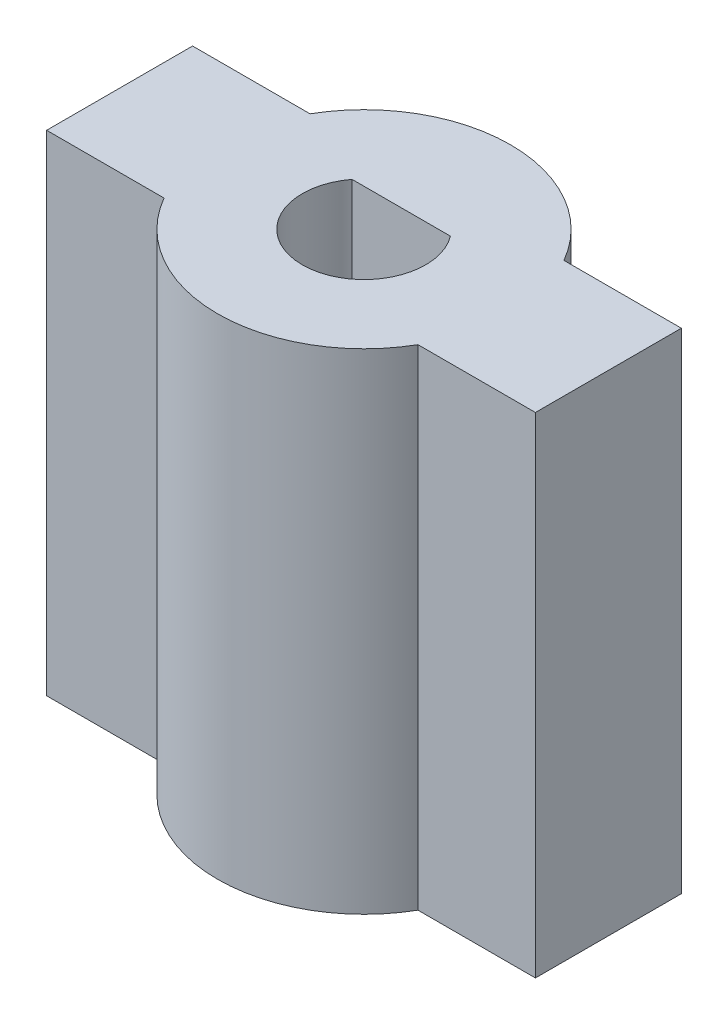
ISO-10303-21;
HEADER;
FILE_DESCRIPTION(('STEP AP214'),'2;1');
FILE_NAME('part.step','',(''),(''),'','','');
FILE_SCHEMA(('AUTOMOTIVE_DESIGN { 1 0 10303 214 1 1 1 1 }'));
ENDSEC;
DATA;
#1=APPLICATION_CONTEXT('core data for automotive mechanical design processes');
#2=APPLICATION_PROTOCOL_DEFINITION('international standard','automotive_design',2000,#1);
#3=PRODUCT_CONTEXT('',#1,'mechanical');
#4=PRODUCT('Part','Part','',(#3));
#5=PRODUCT_RELATED_PRODUCT_CATEGORY('part','',(#4));
#6=PRODUCT_DEFINITION_FORMATION('','',#4);
#7=PRODUCT_DEFINITION_CONTEXT('part definition',#1,'design');
#8=PRODUCT_DEFINITION('design','',#6,#7);
#9=PRODUCT_DEFINITION_SHAPE('','',#8);
#10=(LENGTH_UNIT() NAMED_UNIT(*) SI_UNIT(.MILLI.,.METRE.));
#11=(NAMED_UNIT(*) PLANE_ANGLE_UNIT() SI_UNIT($,.RADIAN.));
#12=(NAMED_UNIT(*) SI_UNIT($,.STERADIAN.) SOLID_ANGLE_UNIT());
#13=UNCERTAINTY_MEASURE_WITH_UNIT(LENGTH_MEASURE(1.E-05),#10,'distance_accuracy_value','');
#14=(GEOMETRIC_REPRESENTATION_CONTEXT(3) GLOBAL_UNCERTAINTY_ASSIGNED_CONTEXT((#13)) GLOBAL_UNIT_ASSIGNED_CONTEXT((#10,
#11,#12)) REPRESENTATION_CONTEXT('',''));
#15=CARTESIAN_POINT('',(0.,0.,0.));
#16=DIRECTION('',(0.,0.,1.));
#17=DIRECTION('',(1.,0.,0.));
#18=AXIS2_PLACEMENT_3D('',#15,#16,#17);
#19=CARTESIAN_POINT('',(0.,20.,0.));
#20=DIRECTION('',(0.,-1.,0.));
#21=DIRECTION('',(0.,0.,-1.));
#22=AXIS2_PLACEMENT_3D('',#19,#20,#21);
#23=CYLINDRICAL_SURFACE('',#22,5.98);
#24=CARTESIAN_POINT('',(0.,0.,0.));
#25=DIRECTION('',(0.,1.,0.));
#26=DIRECTION('',(0.,0.,1.));
#27=AXIS2_PLACEMENT_3D('',#24,#25,#26);
#28=CIRCLE('',#27,5.98);
#29=CARTESIAN_POINT('',(5.18459255872629,0.,-2.98));
#30=VERTEX_POINT('',#29);
#31=CARTESIAN_POINT('',(-5.18459255872629,0.,-2.98));
#32=VERTEX_POINT('',#31);
#33=EDGE_CURVE('E143',#30,#32,#28,.T.);
#34=ORIENTED_EDGE('',*,*,#33,.T.);
#35=DIRECTION('',(0.,-1.,0.));
#36=VECTOR('',#35,1.);
#37=CARTESIAN_POINT('',(-5.18459255872629,20.,-2.98));
#38=LINE('',#37,#36);
#39=CARTESIAN_POINT('',(-5.18459255872629,20.,-2.98));
#40=VERTEX_POINT('',#39);
#41=EDGE_CURVE('E11',#40,#32,#38,.T.);
#42=ORIENTED_EDGE('',*,*,#41,.F.);
#43=CARTESIAN_POINT('',(0.,20.,0.));
#44=DIRECTION('',(0.,1.,0.));
#45=DIRECTION('',(0.,0.,1.));
#46=AXIS2_PLACEMENT_3D('',#43,#44,#45);
#47=CIRCLE('',#46,5.98);
#48=CARTESIAN_POINT('',(5.18459255872629,20.,-2.98));
#49=VERTEX_POINT('',#48);
#50=EDGE_CURVE('E159',#49,#40,#47,.T.);
#51=ORIENTED_EDGE('',*,*,#50,.F.);
#52=DIRECTION('',(0.,-1.,0.));
#53=VECTOR('',#52,1.);
#54=CARTESIAN_POINT('',(5.18459255872629,20.,-2.98));
#55=LINE('',#54,#53);
#56=EDGE_CURVE('E139',#49,#30,#55,.T.);
#57=ORIENTED_EDGE('',*,*,#56,.T.);
#58=EDGE_LOOP('',(#34,#42,#51,#57));
#59=FACE_BOUND('',#58,.T.);
#60=ADVANCED_FACE('F35',(#59),#23,.T.);
#61=CARTESIAN_POINT('',(-5.18459255872629,20.,-2.98));
#62=DIRECTION('',(0.,0.,1.));
#63=DIRECTION('',(1.,0.,0.));
#64=AXIS2_PLACEMENT_3D('',#61,#62,#63);
#65=PLANE('',#64);
#66=DIRECTION('',(-1.,0.,0.));
#67=VECTOR('',#66,1.);
#68=CARTESIAN_POINT('',(-5.18459255872629,0.,-2.98));
#69=LINE('',#68,#67);
#70=CARTESIAN_POINT('',(-9.98,0.,-2.98));
#71=VERTEX_POINT('',#70);
#72=EDGE_CURVE('E146',#32,#71,#69,.T.);
#73=ORIENTED_EDGE('',*,*,#72,.T.);
#74=DIRECTION('',(0.,-1.,0.));
#75=VECTOR('',#74,1.);
#76=CARTESIAN_POINT('',(-9.98,20.,-2.98));
#77=LINE('',#76,#75);
#78=CARTESIAN_POINT('',(-9.98,20.,-2.98));
#79=VERTEX_POINT('',#78);
#80=EDGE_CURVE('E42',#79,#71,#77,.T.);
#81=ORIENTED_EDGE('',*,*,#80,.F.);
#82=DIRECTION('',(-1.,0.,0.));
#83=VECTOR('',#82,1.);
#84=CARTESIAN_POINT('',(-5.18459255872629,20.,-2.98));
#85=LINE('',#84,#83);
#86=EDGE_CURVE('E99',#40,#79,#85,.T.);
#87=ORIENTED_EDGE('',*,*,#86,.F.);
#88=ORIENTED_EDGE('',*,*,#41,.T.);
#89=EDGE_LOOP('',(#73,#81,#87,#88));
#90=FACE_BOUND('',#89,.T.);
#91=ADVANCED_FACE('F232',(#90),#65,.F.);
#92=CARTESIAN_POINT('',(-9.98,20.,2.98));
#93=DIRECTION('',(1.,0.,0.));
#94=DIRECTION('',(0.,0.,-1.));
#95=AXIS2_PLACEMENT_3D('',#92,#93,#94);
#96=PLANE('',#95);
#97=DIRECTION('',(0.,0.,1.));
#98=VECTOR('',#97,1.);
#99=CARTESIAN_POINT('',(-9.98,0.,2.98));
#100=LINE('',#99,#98);
#101=CARTESIAN_POINT('',(-9.98,0.,2.98));
#102=VERTEX_POINT('',#101);
#103=EDGE_CURVE('E149',#71,#102,#100,.T.);
#104=ORIENTED_EDGE('',*,*,#103,.T.);
#105=DIRECTION('',(0.,-1.,0.));
#106=VECTOR('',#105,1.);
#107=CARTESIAN_POINT('',(-9.98,20.,2.98));
#108=LINE('',#107,#106);
#109=CARTESIAN_POINT('',(-9.98,20.,2.98));
#110=VERTEX_POINT('',#109);
#111=EDGE_CURVE('E166',#110,#102,#108,.T.);
#112=ORIENTED_EDGE('',*,*,#111,.F.);
#113=DIRECTION('',(0.,0.,1.));
#114=VECTOR('',#113,1.);
#115=CARTESIAN_POINT('',(-9.98,20.,2.98));
#116=LINE('',#115,#114);
#117=EDGE_CURVE('E174',#79,#110,#116,.T.);
#118=ORIENTED_EDGE('',*,*,#117,.F.);
#119=ORIENTED_EDGE('',*,*,#80,.T.);
#120=EDGE_LOOP('',(#104,#112,#118,#119));
#121=FACE_BOUND('',#120,.T.);
#122=ADVANCED_FACE('F172',(#121),#96,.F.);
#123=CARTESIAN_POINT('',(-5.18459255872629,20.,2.98));
#124=DIRECTION('',(0.,0.,-1.));
#125=DIRECTION('',(-1.,0.,0.));
#126=AXIS2_PLACEMENT_3D('',#123,#124,#125);
#127=PLANE('',#126);
#128=DIRECTION('',(1.,0.,0.));
#129=VECTOR('',#128,1.);
#130=CARTESIAN_POINT('',(-5.18459255872629,0.,2.98));
#131=LINE('',#130,#129);
#132=CARTESIAN_POINT('',(-5.18459255872629,0.,2.98));
#133=VERTEX_POINT('',#132);
#134=EDGE_CURVE('E151',#102,#133,#131,.T.);
#135=ORIENTED_EDGE('',*,*,#134,.T.);
#136=DIRECTION('',(0.,-1.,0.));
#137=VECTOR('',#136,1.);
#138=CARTESIAN_POINT('',(-5.18459255872629,20.,2.98));
#139=LINE('',#138,#137);
#140=CARTESIAN_POINT('',(-5.18459255872629,20.,2.98));
#141=VERTEX_POINT('',#140);
#142=EDGE_CURVE('E163',#141,#133,#139,.T.);
#143=ORIENTED_EDGE('',*,*,#142,.F.);
#144=DIRECTION('',(1.,0.,0.));
#145=VECTOR('',#144,1.);
#146=CARTESIAN_POINT('',(-5.18459255872629,20.,2.98));
#147=LINE('',#146,#145);
#148=EDGE_CURVE('E186',#110,#141,#147,.T.);
#149=ORIENTED_EDGE('',*,*,#148,.F.);
#150=ORIENTED_EDGE('',*,*,#111,.T.);
#151=EDGE_LOOP('',(#135,#143,#149,#150));
#152=FACE_BOUND('',#151,.T.);
#153=ADVANCED_FACE('F182',(#152),#127,.F.);
#154=CARTESIAN_POINT('',(0.,20.,0.));
#155=DIRECTION('',(0.,-1.,0.));
#156=DIRECTION('',(0.,0.,-1.));
#157=AXIS2_PLACEMENT_3D('',#154,#155,#156);
#158=CYLINDRICAL_SURFACE('',#157,5.98);
#159=CARTESIAN_POINT('',(0.,0.,0.));
#160=DIRECTION('',(0.,1.,0.));
#161=DIRECTION('',(0.,0.,1.));
#162=AXIS2_PLACEMENT_3D('',#159,#160,#161);
#163=CIRCLE('',#162,5.98);
#164=CARTESIAN_POINT('',(5.18459255872629,0.,2.98));
#165=VERTEX_POINT('',#164);
#166=EDGE_CURVE('E153',#133,#165,#163,.T.);
#167=ORIENTED_EDGE('',*,*,#166,.T.);
#168=DIRECTION('',(0.,-1.,0.));
#169=VECTOR('',#168,1.);
#170=CARTESIAN_POINT('',(5.18459255872629,20.,2.98));
#171=LINE('',#170,#169);
#172=CARTESIAN_POINT('',(5.18459255872629,20.,2.98));
#173=VERTEX_POINT('',#172);
#174=EDGE_CURVE('E134',#173,#165,#171,.T.);
#175=ORIENTED_EDGE('',*,*,#174,.F.);
#176=CARTESIAN_POINT('',(0.,20.,0.));
#177=DIRECTION('',(0.,1.,0.));
#178=DIRECTION('',(0.,0.,1.));
#179=AXIS2_PLACEMENT_3D('',#176,#177,#178);
#180=CIRCLE('',#179,5.98);
#181=EDGE_CURVE('E122',#141,#173,#180,.T.);
#182=ORIENTED_EDGE('',*,*,#181,.F.);
#183=ORIENTED_EDGE('',*,*,#142,.T.);
#184=EDGE_LOOP('',(#167,#175,#182,#183));
#185=FACE_BOUND('',#184,.T.);
#186=ADVANCED_FACE('F185',(#185),#158,.T.);
#187=CARTESIAN_POINT('',(9.98,20.,2.98));
#188=DIRECTION('',(0.,0.,-1.));
#189=DIRECTION('',(-1.,0.,0.));
#190=AXIS2_PLACEMENT_3D('',#187,#188,#189);
#191=PLANE('',#190);
#192=DIRECTION('',(1.,0.,0.));
#193=VECTOR('',#192,1.);
#194=CARTESIAN_POINT('',(9.98,0.,2.98));
#195=LINE('',#194,#193);
#196=CARTESIAN_POINT('',(9.98,0.,2.98));
#197=VERTEX_POINT('',#196);
#198=EDGE_CURVE('E131',#165,#197,#195,.T.);
#199=ORIENTED_EDGE('',*,*,#198,.T.);
#200=DIRECTION('',(0.,-1.,0.));
#201=VECTOR('',#200,1.);
#202=CARTESIAN_POINT('',(9.98,20.,2.98));
#203=LINE('',#202,#201);
#204=CARTESIAN_POINT('',(9.98,20.,2.98));
#205=VERTEX_POINT('',#204);
#206=EDGE_CURVE('E128',#205,#197,#203,.T.);
#207=ORIENTED_EDGE('',*,*,#206,.F.);
#208=DIRECTION('',(1.,0.,0.));
#209=VECTOR('',#208,1.);
#210=CARTESIAN_POINT('',(9.98,20.,2.98));
#211=LINE('',#210,#209);
#212=EDGE_CURVE('E115',#173,#205,#211,.T.);
#213=ORIENTED_EDGE('',*,*,#212,.F.);
#214=ORIENTED_EDGE('',*,*,#174,.T.);
#215=EDGE_LOOP('',(#199,#207,#213,#214));
#216=FACE_BOUND('',#215,.T.);
#217=ADVANCED_FACE('F129',(#216),#191,.F.);
#218=CARTESIAN_POINT('',(9.98,20.,2.98));
#219=DIRECTION('',(-1.,0.,0.));
#220=DIRECTION('',(0.,0.,1.));
#221=AXIS2_PLACEMENT_3D('',#218,#219,#220);
#222=PLANE('',#221);
#223=DIRECTION('',(0.,0.,-1.));
#224=VECTOR('',#223,1.);
#225=CARTESIAN_POINT('',(9.98,0.,2.98));
#226=LINE('',#225,#224);
#227=CARTESIAN_POINT('',(9.98,0.,-2.98));
#228=VERTEX_POINT('',#227);
#229=EDGE_CURVE('E156',#197,#228,#226,.T.);
#230=ORIENTED_EDGE('',*,*,#229,.T.);
#231=DIRECTION('',(0.,-1.,0.));
#232=VECTOR('',#231,1.);
#233=CARTESIAN_POINT('',(9.98,20.,-2.98));
#234=LINE('',#233,#232);
#235=CARTESIAN_POINT('',(9.98,20.,-2.98));
#236=VERTEX_POINT('',#235);
#237=EDGE_CURVE('E135',#236,#228,#234,.T.);
#238=ORIENTED_EDGE('',*,*,#237,.F.);
#239=DIRECTION('',(0.,0.,-1.));
#240=VECTOR('',#239,1.);
#241=CARTESIAN_POINT('',(9.98,20.,2.98));
#242=LINE('',#241,#240);
#243=EDGE_CURVE('E119',#205,#236,#242,.T.);
#244=ORIENTED_EDGE('',*,*,#243,.F.);
#245=ORIENTED_EDGE('',*,*,#206,.T.);
#246=EDGE_LOOP('',(#230,#238,#244,#245));
#247=FACE_BOUND('',#246,.T.);
#248=ADVANCED_FACE('F137',(#247),#222,.F.);
#249=CARTESIAN_POINT('',(9.98,20.,-2.98));
#250=DIRECTION('',(0.,0.,1.));
#251=DIRECTION('',(1.,0.,0.));
#252=AXIS2_PLACEMENT_3D('',#249,#250,#251);
#253=PLANE('',#252);
#254=DIRECTION('',(-1.,0.,0.));
#255=VECTOR('',#254,1.);
#256=CARTESIAN_POINT('',(9.98,0.,-2.98));
#257=LINE('',#256,#255);
#258=EDGE_CURVE('E91',#228,#30,#257,.T.);
#259=ORIENTED_EDGE('',*,*,#258,.T.);
#260=ORIENTED_EDGE('',*,*,#56,.F.);
#261=DIRECTION('',(-1.,0.,0.));
#262=VECTOR('',#261,1.);
#263=CARTESIAN_POINT('',(9.98,20.,-2.98));
#264=LINE('',#263,#262);
#265=EDGE_CURVE('E58',#236,#49,#264,.T.);
#266=ORIENTED_EDGE('',*,*,#265,.F.);
#267=ORIENTED_EDGE('',*,*,#237,.T.);
#268=EDGE_LOOP('',(#259,#260,#266,#267));
#269=FACE_BOUND('',#268,.T.);
#270=ADVANCED_FACE('F227',(#269),#253,.F.);
#271=CARTESIAN_POINT('',(0.,20.,0.));
#272=DIRECTION('',(0.,1.,0.));
#273=DIRECTION('',(0.,0.,1.));
#274=AXIS2_PLACEMENT_3D('',#271,#272,#273);
#275=PLANE('',#274);
#276=CARTESIAN_POINT('',(0.,20.,0.));
#277=DIRECTION('',(0.,1.,0.));
#278=DIRECTION('',(0.,0.,1.));
#279=AXIS2_PLACEMENT_3D('',#276,#277,#278);
#280=CIRCLE('',#279,2.52);
#281=CARTESIAN_POINT('',(-2.00997512422418,20.,-1.52));
#282=VERTEX_POINT('',#281);
#283=CARTESIAN_POINT('',(2.00997512422418,20.,-1.52));
#284=VERTEX_POINT('',#283);
#285=EDGE_CURVE('E49',#282,#284,#280,.T.);
#286=ORIENTED_EDGE('',*,*,#285,.F.);
#287=DIRECTION('',(1.,0.,0.));
#288=VECTOR('',#287,1.);
#289=CARTESIAN_POINT('',(-2.00997512422418,20.,-1.52));
#290=LINE('',#289,#288);
#291=EDGE_CURVE('E196',#282,#284,#290,.T.);
#292=ORIENTED_EDGE('',*,*,#291,.T.);
#293=EDGE_LOOP('',(#286,#292));
#294=FACE_BOUND('',#293,.T.);
#295=ORIENTED_EDGE('',*,*,#50,.T.);
#296=ORIENTED_EDGE('',*,*,#86,.T.);
#297=ORIENTED_EDGE('',*,*,#117,.T.);
#298=ORIENTED_EDGE('',*,*,#148,.T.);
#299=ORIENTED_EDGE('',*,*,#181,.T.);
#300=ORIENTED_EDGE('',*,*,#212,.T.);
#301=ORIENTED_EDGE('',*,*,#243,.T.);
#302=ORIENTED_EDGE('',*,*,#265,.T.);
#303=EDGE_LOOP('',(#295,#296,#297,#298,#299,#300,#301,#302));
#304=FACE_BOUND('',#303,.T.);
#305=ADVANCED_FACE('F117',(#294,#304),#275,.T.);
#306=CARTESIAN_POINT('',(0.,0.,0.));
#307=DIRECTION('',(0.,1.,0.));
#308=DIRECTION('',(0.,0.,1.));
#309=AXIS2_PLACEMENT_3D('',#306,#307,#308);
#310=PLANE('',#309);
#311=CARTESIAN_POINT('',(0.,0.,0.));
#312=DIRECTION('',(0.,-1.,0.));
#313=DIRECTION('',(0.,0.,-1.));
#314=AXIS2_PLACEMENT_3D('',#311,#312,#313);
#315=CIRCLE('',#314,2.52);
#316=CARTESIAN_POINT('',(0.,0.,-2.52));
#317=VERTEX_POINT('',#316);
#318=EDGE_CURVE('E203',#317,#317,#315,.T.);
#319=ORIENTED_EDGE('',*,*,#318,.F.);
#320=EDGE_LOOP('',(#319));
#321=FACE_BOUND('',#320,.T.);
#322=ORIENTED_EDGE('',*,*,#33,.F.);
#323=ORIENTED_EDGE('',*,*,#258,.F.);
#324=ORIENTED_EDGE('',*,*,#229,.F.);
#325=ORIENTED_EDGE('',*,*,#198,.F.);
#326=ORIENTED_EDGE('',*,*,#166,.F.);
#327=ORIENTED_EDGE('',*,*,#134,.F.);
#328=ORIENTED_EDGE('',*,*,#103,.F.);
#329=ORIENTED_EDGE('',*,*,#72,.F.);
#330=EDGE_LOOP('',(#322,#323,#324,#325,#326,#327,#328,#329));
#331=FACE_BOUND('',#330,.T.);
#332=ADVANCED_FACE('F178',(#321,#331),#310,.F.);
#333=CARTESIAN_POINT('',(0.,5.,0.));
#334=DIRECTION('',(0.,1.,0.));
#335=DIRECTION('',(0.,0.,1.));
#336=AXIS2_PLACEMENT_3D('',#333,#334,#335);
#337=CYLINDRICAL_SURFACE('',#336,2.52);
#338=ORIENTED_EDGE('',*,*,#285,.T.);
#339=DIRECTION('',(0.,1.,0.));
#340=VECTOR('',#339,1.);
#341=CARTESIAN_POINT('',(2.00997512422418,5.,-1.52));
#342=LINE('',#341,#340);
#343=CARTESIAN_POINT('',(2.00997512422418,5.,-1.52));
#344=VERTEX_POINT('',#343);
#345=EDGE_CURVE('E192',#344,#284,#342,.T.);
#346=ORIENTED_EDGE('',*,*,#345,.F.);
#347=CARTESIAN_POINT('',(0.,5.,0.));
#348=DIRECTION('',(0.,-1.,0.));
#349=DIRECTION('',(0.,0.,-1.));
#350=AXIS2_PLACEMENT_3D('',#347,#348,#349);
#351=CIRCLE('',#350,2.52);
#352=CARTESIAN_POINT('',(-2.00997512422418,5.,-1.52));
#353=VERTEX_POINT('',#352);
#354=EDGE_CURVE('E200',#353,#344,#351,.T.);
#355=ORIENTED_EDGE('',*,*,#354,.F.);
#356=DIRECTION('',(0.,1.,0.));
#357=VECTOR('',#356,1.);
#358=CARTESIAN_POINT('',(-2.00997512422418,5.,-1.52));
#359=LINE('',#358,#357);
#360=EDGE_CURVE('E147',#353,#282,#359,.T.);
#361=ORIENTED_EDGE('',*,*,#360,.T.);
#362=EDGE_LOOP('',(#338,#346,#355,#361));
#363=FACE_BOUND('',#362,.T.);
#364=ORIENTED_EDGE('',*,*,#318,.T.);
#365=EDGE_LOOP('',(#364));
#366=FACE_BOUND('',#365,.T.);
#367=ADVANCED_FACE('F216',(#363,#366),#337,.F.);
#368=CARTESIAN_POINT('',(-2.00997512422418,5.,-1.52));
#369=DIRECTION('',(0.,0.,1.));
#370=DIRECTION('',(1.,0.,0.));
#371=AXIS2_PLACEMENT_3D('',#368,#369,#370);
#372=PLANE('',#371);
#373=ORIENTED_EDGE('',*,*,#291,.F.);
#374=ORIENTED_EDGE('',*,*,#360,.F.);
#375=DIRECTION('',(1.,0.,0.));
#376=VECTOR('',#375,1.);
#377=CARTESIAN_POINT('',(-2.00997512422418,5.,-1.52));
#378=LINE('',#377,#376);
#379=EDGE_CURVE('E194',#353,#344,#378,.T.);
#380=ORIENTED_EDGE('',*,*,#379,.T.);
#381=ORIENTED_EDGE('',*,*,#345,.T.);
#382=EDGE_LOOP('',(#373,#374,#380,#381));
#383=FACE_BOUND('',#382,.T.);
#384=ADVANCED_FACE('F215',(#383),#372,.T.);
#385=CARTESIAN_POINT('',(0.,5.,0.));
#386=DIRECTION('',(0.,-1.,0.));
#387=DIRECTION('',(0.,0.,-1.));
#388=AXIS2_PLACEMENT_3D('',#385,#386,#387);
#389=PLANE('',#388);
#390=ORIENTED_EDGE('',*,*,#354,.T.);
#391=ORIENTED_EDGE('',*,*,#379,.F.);
#392=EDGE_LOOP('',(#390,#391));
#393=FACE_BOUND('',#392,.T.);
#394=ADVANCED_FACE('F210',(#393),#389,.T.);
#395=CLOSED_SHELL('',(#60,#91,#122,#153,#186,#217,#248,#270,#305,#332,#367,#384,#394));
#396=MANIFOLD_SOLID_BREP('B2',#395);
#397=ADVANCED_BREP_SHAPE_REPRESENTATION('',(#18,#396),#14);
#398=SHAPE_DEFINITION_REPRESENTATION(#9,#397);
ENDSEC;
END-ISO-10303-21;
